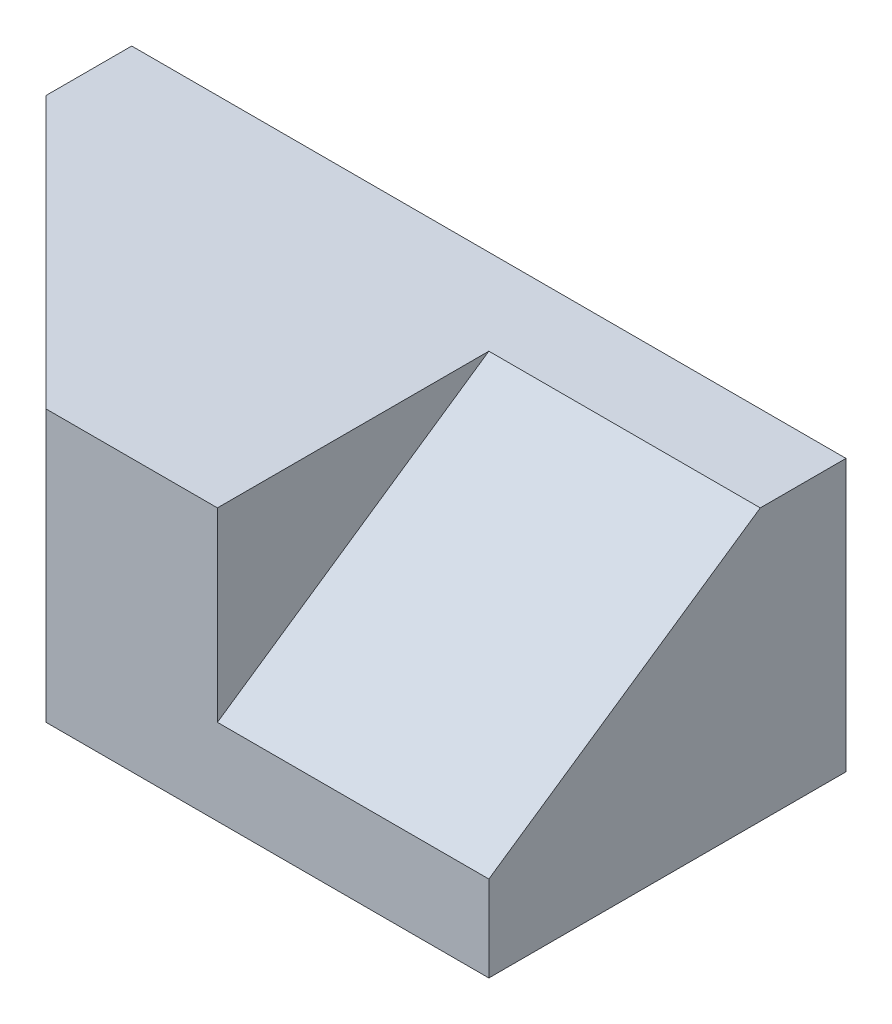
ISO-10303-21;
HEADER;
FILE_DESCRIPTION(('STEP AP214'),'2;1');
FILE_NAME('part.step','',(''),(''),'','','');
FILE_SCHEMA(('AUTOMOTIVE_DESIGN { 1 0 10303 214 1 1 1 1 }'));
ENDSEC;
DATA;
#1=APPLICATION_CONTEXT('core data for automotive mechanical design processes');
#2=APPLICATION_PROTOCOL_DEFINITION('international standard','automotive_design',2000,#1);
#3=PRODUCT_CONTEXT('',#1,'mechanical');
#4=PRODUCT('Part','Part','',(#3));
#5=PRODUCT_RELATED_PRODUCT_CATEGORY('part','',(#4));
#6=PRODUCT_DEFINITION_FORMATION('','',#4);
#7=PRODUCT_DEFINITION_CONTEXT('part definition',#1,'design');
#8=PRODUCT_DEFINITION('design','',#6,#7);
#9=PRODUCT_DEFINITION_SHAPE('','',#8);
#10=(LENGTH_UNIT() NAMED_UNIT(*) SI_UNIT(.MILLI.,.METRE.));
#11=(NAMED_UNIT(*) PLANE_ANGLE_UNIT() SI_UNIT($,.RADIAN.));
#12=(NAMED_UNIT(*) SI_UNIT($,.STERADIAN.) SOLID_ANGLE_UNIT());
#13=UNCERTAINTY_MEASURE_WITH_UNIT(LENGTH_MEASURE(1.E-05),#10,'distance_accuracy_value','');
#14=(GEOMETRIC_REPRESENTATION_CONTEXT(3) GLOBAL_UNCERTAINTY_ASSIGNED_CONTEXT((#13)) GLOBAL_UNIT_ASSIGNED_CONTEXT((#10,
#11,#12)) REPRESENTATION_CONTEXT('',''));
#15=CARTESIAN_POINT('',(0.,0.,0.));
#16=DIRECTION('',(0.,0.,1.));
#17=DIRECTION('',(1.,0.,0.));
#18=AXIS2_PLACEMENT_3D('',#15,#16,#17);
#19=CARTESIAN_POINT('',(0.,38.,0.));
#20=DIRECTION('',(-1.,0.,0.));
#21=DIRECTION('',(0.,0.,1.));
#22=AXIS2_PLACEMENT_3D('',#19,#20,#21);
#23=PLANE('',#22);
#24=DIRECTION('',(0.,0.56468391559199,-0.825307261249832));
#25=VECTOR('',#24,1.);
#26=CARTESIAN_POINT('',(0.,38.,-38.));
#27=LINE('',#26,#25);
#28=CARTESIAN_POINT('',(0.,12.,0.));
#29=VERTEX_POINT('',#28);
#30=CARTESIAN_POINT('',(0.,38.,-38.));
#31=VERTEX_POINT('',#30);
#32=EDGE_CURVE('E107',#29,#31,#27,.T.);
#33=ORIENTED_EDGE('',*,*,#32,.F.);
#34=DIRECTION('',(0.,-1.,0.));
#35=VECTOR('',#34,1.);
#36=CARTESIAN_POINT('',(0.,38.,0.));
#37=LINE('',#36,#35);
#38=CARTESIAN_POINT('',(0.,0.,0.));
#39=VERTEX_POINT('',#38);
#40=EDGE_CURVE('E125',#29,#39,#37,.T.);
#41=ORIENTED_EDGE('',*,*,#40,.T.);
#42=DIRECTION('',(0.,0.,-1.));
#43=VECTOR('',#42,1.);
#44=CARTESIAN_POINT('',(0.,0.,0.));
#45=LINE('',#44,#43);
#46=CARTESIAN_POINT('',(0.,0.,-50.));
#47=VERTEX_POINT('',#46);
#48=EDGE_CURVE('E88',#39,#47,#45,.T.);
#49=ORIENTED_EDGE('',*,*,#48,.T.);
#50=DIRECTION('',(0.,-1.,0.));
#51=VECTOR('',#50,1.);
#52=CARTESIAN_POINT('',(0.,38.,-50.));
#53=LINE('',#52,#51);
#54=CARTESIAN_POINT('',(0.,38.,-50.));
#55=VERTEX_POINT('',#54);
#56=EDGE_CURVE('E121',#55,#47,#53,.T.);
#57=ORIENTED_EDGE('',*,*,#56,.F.);
#58=DIRECTION('',(0.,0.,-1.));
#59=VECTOR('',#58,1.);
#60=CARTESIAN_POINT('',(0.,38.,0.));
#61=LINE('',#60,#59);
#62=EDGE_CURVE('E64',#31,#55,#61,.T.);
#63=ORIENTED_EDGE('',*,*,#62,.F.);
#64=EDGE_LOOP('',(#33,#41,#49,#57,#63));
#65=FACE_BOUND('',#64,.T.);
#66=ADVANCED_FACE('F41',(#65),#23,.F.);
#67=CARTESIAN_POINT('',(0.,38.,-50.));
#68=DIRECTION('',(0.,0.,1.));
#69=DIRECTION('',(1.,0.,0.));
#70=AXIS2_PLACEMENT_3D('',#67,#68,#69);
#71=PLANE('',#70);
#72=DIRECTION('',(-1.,0.,0.));
#73=VECTOR('',#72,1.);
#74=CARTESIAN_POINT('',(0.,0.,-50.));
#75=LINE('',#74,#73);
#76=CARTESIAN_POINT('',(-100.,0.,-50.));
#77=VERTEX_POINT('',#76);
#78=EDGE_CURVE('E119',#47,#77,#75,.T.);
#79=ORIENTED_EDGE('',*,*,#78,.T.);
#80=DIRECTION('',(0.,-1.,0.));
#81=VECTOR('',#80,1.);
#82=CARTESIAN_POINT('',(-100.,38.,-50.));
#83=LINE('',#82,#81);
#84=CARTESIAN_POINT('',(-100.,38.,-50.));
#85=VERTEX_POINT('',#84);
#86=EDGE_CURVE('E11',#85,#77,#83,.T.);
#87=ORIENTED_EDGE('',*,*,#86,.F.);
#88=DIRECTION('',(-1.,0.,0.));
#89=VECTOR('',#88,1.);
#90=CARTESIAN_POINT('',(0.,38.,-50.));
#91=LINE('',#90,#89);
#92=EDGE_CURVE('E140',#55,#85,#91,.T.);
#93=ORIENTED_EDGE('',*,*,#92,.F.);
#94=ORIENTED_EDGE('',*,*,#56,.T.);
#95=EDGE_LOOP('',(#79,#87,#93,#94));
#96=FACE_BOUND('',#95,.T.);
#97=ADVANCED_FACE('F43',(#96),#71,.F.);
#98=CARTESIAN_POINT('',(-100.,38.,-50.));
#99=DIRECTION('',(1.,0.,0.));
#100=DIRECTION('',(0.,0.,-1.));
#101=AXIS2_PLACEMENT_3D('',#98,#99,#100);
#102=PLANE('',#101);
#103=DIRECTION('',(0.,0.,1.));
#104=VECTOR('',#103,1.);
#105=CARTESIAN_POINT('',(-100.,0.,-50.));
#106=LINE('',#105,#104);
#107=CARTESIAN_POINT('',(-100.,0.,-38.));
#108=VERTEX_POINT('',#107);
#109=EDGE_CURVE('E133',#77,#108,#106,.T.);
#110=ORIENTED_EDGE('',*,*,#109,.T.);
#111=DIRECTION('',(0.,-1.,0.));
#112=VECTOR('',#111,1.);
#113=CARTESIAN_POINT('',(-100.,38.,-38.));
#114=LINE('',#113,#112);
#115=CARTESIAN_POINT('',(-100.,38.,-38.));
#116=VERTEX_POINT('',#115);
#117=EDGE_CURVE('E49',#116,#108,#114,.T.);
#118=ORIENTED_EDGE('',*,*,#117,.F.);
#119=DIRECTION('',(0.,0.,1.));
#120=VECTOR('',#119,1.);
#121=CARTESIAN_POINT('',(-100.,38.,-50.));
#122=LINE('',#121,#120);
#123=EDGE_CURVE('E95',#85,#116,#122,.T.);
#124=ORIENTED_EDGE('',*,*,#123,.F.);
#125=ORIENTED_EDGE('',*,*,#86,.T.);
#126=EDGE_LOOP('',(#110,#118,#124,#125));
#127=FACE_BOUND('',#126,.T.);
#128=ADVANCED_FACE('F179',(#127),#102,.F.);
#129=CARTESIAN_POINT('',(-100.,38.,-38.));
#130=DIRECTION('',(0.707106781186547,0.,-0.707106781186548));
#131=DIRECTION('',(-0.707106781186548,0.,-0.707106781186547));
#132=AXIS2_PLACEMENT_3D('',#129,#130,#131);
#133=PLANE('',#132);
#134=DIRECTION('',(0.707106781186548,0.,0.707106781186547));
#135=VECTOR('',#134,1.);
#136=CARTESIAN_POINT('',(-100.,0.,-38.));
#137=LINE('',#136,#135);
#138=CARTESIAN_POINT('',(-62.,0.,0.));
#139=VERTEX_POINT('',#138);
#140=EDGE_CURVE('E135',#108,#139,#137,.T.);
#141=ORIENTED_EDGE('',*,*,#140,.T.);
#142=DIRECTION('',(0.,-1.,0.));
#143=VECTOR('',#142,1.);
#144=CARTESIAN_POINT('',(-62.,38.,0.));
#145=LINE('',#144,#143);
#146=CARTESIAN_POINT('',(-62.,38.,0.));
#147=VERTEX_POINT('',#146);
#148=EDGE_CURVE('E143',#147,#139,#145,.T.);
#149=ORIENTED_EDGE('',*,*,#148,.F.);
#150=DIRECTION('',(0.707106781186548,0.,0.707106781186547));
#151=VECTOR('',#150,1.);
#152=CARTESIAN_POINT('',(-100.,38.,-38.));
#153=LINE('',#152,#151);
#154=EDGE_CURVE('E127',#116,#147,#153,.T.);
#155=ORIENTED_EDGE('',*,*,#154,.F.);
#156=ORIENTED_EDGE('',*,*,#117,.T.);
#157=EDGE_LOOP('',(#141,#149,#155,#156));
#158=FACE_BOUND('',#157,.T.);
#159=ADVANCED_FACE('F149',(#158),#133,.F.);
#160=CARTESIAN_POINT('',(-62.,38.,0.));
#161=DIRECTION('',(0.,0.,-1.));
#162=DIRECTION('',(-1.,0.,0.));
#163=AXIS2_PLACEMENT_3D('',#160,#161,#162);
#164=PLANE('',#163);
#165=ORIENTED_EDGE('',*,*,#40,.F.);
#166=DIRECTION('',(-1.,0.,0.));
#167=VECTOR('',#166,1.);
#168=CARTESIAN_POINT('',(272.605894191255,12.,0.));
#169=LINE('',#168,#167);
#170=CARTESIAN_POINT('',(-38.,12.,0.));
#171=VERTEX_POINT('',#170);
#172=EDGE_CURVE('E110',#29,#171,#169,.T.);
#173=ORIENTED_EDGE('',*,*,#172,.T.);
#174=DIRECTION('',(0.,-1.,0.));
#175=VECTOR('',#174,1.);
#176=CARTESIAN_POINT('',(-38.,38.,0.));
#177=LINE('',#176,#175);
#178=CARTESIAN_POINT('',(-38.,38.,0.));
#179=VERTEX_POINT('',#178);
#180=EDGE_CURVE('E113',#179,#171,#177,.T.);
#181=ORIENTED_EDGE('',*,*,#180,.F.);
#182=DIRECTION('',(1.,0.,0.));
#183=VECTOR('',#182,1.);
#184=CARTESIAN_POINT('',(-62.,38.,0.));
#185=LINE('',#184,#183);
#186=EDGE_CURVE('E123',#147,#179,#185,.T.);
#187=ORIENTED_EDGE('',*,*,#186,.F.);
#188=ORIENTED_EDGE('',*,*,#148,.T.);
#189=DIRECTION('',(1.,0.,0.));
#190=VECTOR('',#189,1.);
#191=CARTESIAN_POINT('',(-62.,0.,0.));
#192=LINE('',#191,#190);
#193=EDGE_CURVE('E137',#139,#39,#192,.T.);
#194=ORIENTED_EDGE('',*,*,#193,.T.);
#195=EDGE_LOOP('',(#165,#173,#181,#187,#188,#194));
#196=FACE_BOUND('',#195,.T.);
#197=ADVANCED_FACE('F156',(#196),#164,.F.);
#198=CARTESIAN_POINT('',(0.,38.,0.));
#199=DIRECTION('',(0.,1.,0.));
#200=DIRECTION('',(0.,0.,1.));
#201=AXIS2_PLACEMENT_3D('',#198,#199,#200);
#202=PLANE('',#201);
#203=DIRECTION('',(-1.,0.,0.));
#204=VECTOR('',#203,1.);
#205=CARTESIAN_POINT('',(272.605894191255,38.,-38.));
#206=LINE('',#205,#204);
#207=CARTESIAN_POINT('',(-38.,38.,-38.));
#208=VERTEX_POINT('',#207);
#209=EDGE_CURVE('E56',#31,#208,#206,.T.);
#210=ORIENTED_EDGE('',*,*,#209,.F.);
#211=ORIENTED_EDGE('',*,*,#62,.T.);
#212=ORIENTED_EDGE('',*,*,#92,.T.);
#213=ORIENTED_EDGE('',*,*,#123,.T.);
#214=ORIENTED_EDGE('',*,*,#154,.T.);
#215=ORIENTED_EDGE('',*,*,#186,.T.);
#216=DIRECTION('',(0.,0.,-1.));
#217=VECTOR('',#216,1.);
#218=CARTESIAN_POINT('',(-38.,38.,0.));
#219=LINE('',#218,#217);
#220=EDGE_CURVE('E118',#179,#208,#219,.T.);
#221=ORIENTED_EDGE('',*,*,#220,.T.);
#222=EDGE_LOOP('',(#210,#211,#212,#213,#214,#215,#221));
#223=FACE_BOUND('',#222,.T.);
#224=ADVANCED_FACE('F116',(#223),#202,.T.);
#225=CARTESIAN_POINT('',(0.,0.,0.));
#226=DIRECTION('',(0.,1.,0.));
#227=DIRECTION('',(0.,0.,1.));
#228=AXIS2_PLACEMENT_3D('',#225,#226,#227);
#229=PLANE('',#228);
#230=ORIENTED_EDGE('',*,*,#78,.F.);
#231=ORIENTED_EDGE('',*,*,#48,.F.);
#232=ORIENTED_EDGE('',*,*,#193,.F.);
#233=ORIENTED_EDGE('',*,*,#140,.F.);
#234=ORIENTED_EDGE('',*,*,#109,.F.);
#235=EDGE_LOOP('',(#230,#231,#232,#233,#234));
#236=FACE_BOUND('',#235,.T.);
#237=ADVANCED_FACE('F154',(#236),#229,.F.);
#238=CARTESIAN_POINT('',(272.605894191255,38.,-38.));
#239=DIRECTION('',(0.,-0.825307261249832,-0.56468391559199));
#240=DIRECTION('',(0.,0.56468391559199,-0.825307261249832));
#241=AXIS2_PLACEMENT_3D('',#238,#239,#240);
#242=PLANE('',#241);
#243=ORIENTED_EDGE('',*,*,#32,.T.);
#244=ORIENTED_EDGE('',*,*,#209,.T.);
#245=DIRECTION('',(0.,0.56468391559199,-0.825307261249832));
#246=VECTOR('',#245,1.);
#247=CARTESIAN_POINT('',(-38.,38.,-38.));
#248=LINE('',#247,#246);
#249=EDGE_CURVE('E112',#171,#208,#248,.T.);
#250=ORIENTED_EDGE('',*,*,#249,.F.);
#251=ORIENTED_EDGE('',*,*,#172,.F.);
#252=EDGE_LOOP('',(#243,#244,#250,#251));
#253=FACE_BOUND('',#252,.T.);
#254=ADVANCED_FACE('F108',(#253),#242,.F.);
#255=CARTESIAN_POINT('',(-38.,38.,0.));
#256=DIRECTION('',(-1.,0.,0.));
#257=DIRECTION('',(0.,0.,1.));
#258=AXIS2_PLACEMENT_3D('',#255,#256,#257);
#259=PLANE('',#258);
#260=ORIENTED_EDGE('',*,*,#249,.T.);
#261=ORIENTED_EDGE('',*,*,#220,.F.);
#262=ORIENTED_EDGE('',*,*,#180,.T.);
#263=EDGE_LOOP('',(#260,#261,#262));
#264=FACE_BOUND('',#263,.T.);
#265=ADVANCED_FACE('F166',(#264),#259,.F.);
#266=CLOSED_SHELL('',(#66,#97,#128,#159,#197,#224,#237,#254,#265));
#267=MANIFOLD_SOLID_BREP('B2',#266);
#268=ADVANCED_BREP_SHAPE_REPRESENTATION('',(#18,#267),#14);
#269=SHAPE_DEFINITION_REPRESENTATION(#9,#268);
ENDSEC;
END-ISO-10303-21;
